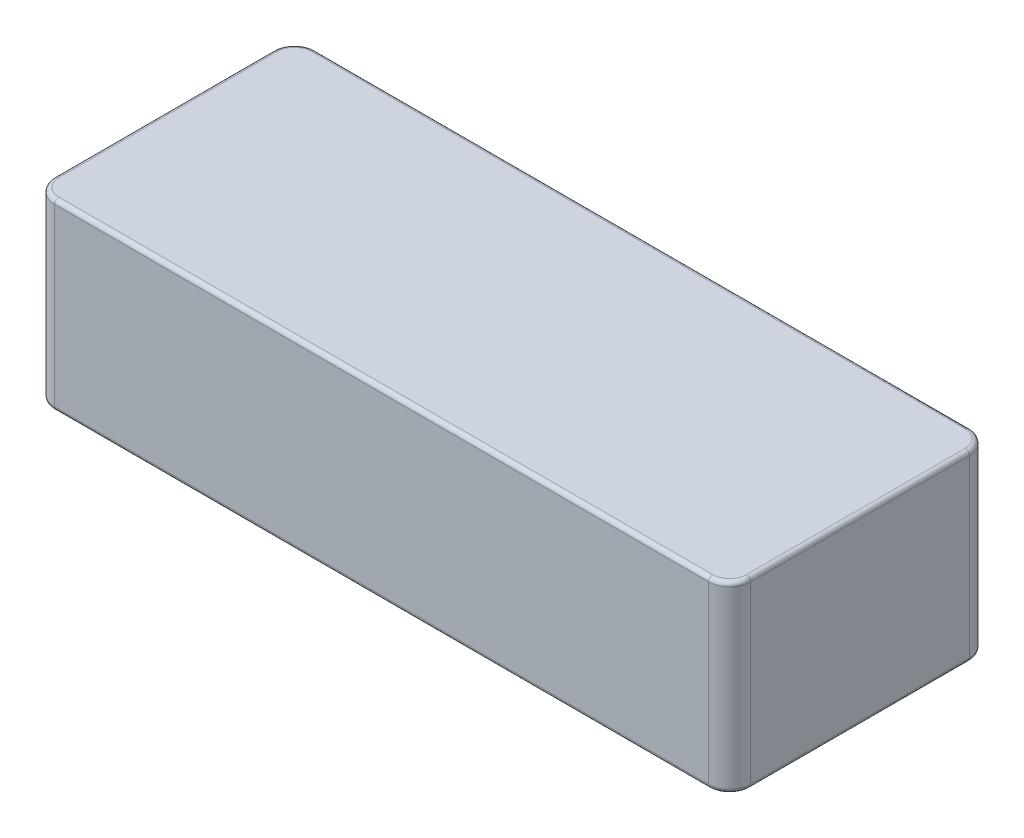
ISO-10303-21;
HEADER;
FILE_DESCRIPTION(('STEP AP214'),'2;1');
FILE_NAME('part.step','',(''),(''),'','','');
FILE_SCHEMA(('AUTOMOTIVE_DESIGN { 1 0 10303 214 1 1 1 1 }'));
ENDSEC;
DATA;
#1=APPLICATION_CONTEXT('core data for automotive mechanical design processes');
#2=APPLICATION_PROTOCOL_DEFINITION('international standard','automotive_design',2000,#1);
#3=PRODUCT_CONTEXT('',#1,'mechanical');
#4=PRODUCT('Part','Part','',(#3));
#5=PRODUCT_RELATED_PRODUCT_CATEGORY('part','',(#4));
#6=PRODUCT_DEFINITION_FORMATION('','',#4);
#7=PRODUCT_DEFINITION_CONTEXT('part definition',#1,'design');
#8=PRODUCT_DEFINITION('design','',#6,#7);
#9=PRODUCT_DEFINITION_SHAPE('','',#8);
#10=(LENGTH_UNIT() NAMED_UNIT(*) SI_UNIT(.MILLI.,.METRE.));
#11=(NAMED_UNIT(*) PLANE_ANGLE_UNIT() SI_UNIT($,.RADIAN.));
#12=(NAMED_UNIT(*) SI_UNIT($,.STERADIAN.) SOLID_ANGLE_UNIT());
#13=UNCERTAINTY_MEASURE_WITH_UNIT(LENGTH_MEASURE(1.E-05),#10,'distance_accuracy_value','');
#14=(GEOMETRIC_REPRESENTATION_CONTEXT(3) GLOBAL_UNCERTAINTY_ASSIGNED_CONTEXT((#13)) GLOBAL_UNIT_ASSIGNED_CONTEXT((#10,
#11,#12)) REPRESENTATION_CONTEXT('',''));
#15=CARTESIAN_POINT('',(0.,0.,0.));
#16=DIRECTION('',(0.,0.,1.));
#17=DIRECTION('',(1.,0.,0.));
#18=AXIS2_PLACEMENT_3D('',#15,#16,#17);
#19=CARTESIAN_POINT('',(83.,43.8,31.1));
#20=DIRECTION('',(-1.,0.,0.));
#21=DIRECTION('',(0.,0.,1.));
#22=AXIS2_PLACEMENT_3D('',#19,#20,#21);
#23=PLANE('',#22);
#24=DIRECTION('',(0.,-1.,0.));
#25=VECTOR('',#24,1.);
#26=CARTESIAN_POINT('',(83.,43.8,26.1));
#27=LINE('',#26,#25);
#28=CARTESIAN_POINT('',(83.,42.8,26.1));
#29=VERTEX_POINT('',#28);
#30=CARTESIAN_POINT('',(83.,1.,26.1));
#31=VERTEX_POINT('',#30);
#32=EDGE_CURVE('E290',#29,#31,#27,.T.);
#33=ORIENTED_EDGE('',*,*,#32,.T.);
#34=DIRECTION('',(0.,0.,-1.));
#35=VECTOR('',#34,1.);
#36=CARTESIAN_POINT('',(83.,1.,-26.1));
#37=LINE('',#36,#35);
#38=CARTESIAN_POINT('',(83.,1.,-26.1));
#39=VERTEX_POINT('',#38);
#40=EDGE_CURVE('E207',#31,#39,#37,.T.);
#41=ORIENTED_EDGE('',*,*,#40,.T.);
#42=DIRECTION('',(0.,-1.,0.));
#43=VECTOR('',#42,1.);
#44=CARTESIAN_POINT('',(83.,43.8,-26.1));
#45=LINE('',#44,#43);
#46=CARTESIAN_POINT('',(83.,42.8,-26.1));
#47=VERTEX_POINT('',#46);
#48=EDGE_CURVE('E295',#39,#47,#45,.F.);
#49=ORIENTED_EDGE('',*,*,#48,.T.);
#50=DIRECTION('',(0.,0.,-1.));
#51=VECTOR('',#50,1.);
#52=CARTESIAN_POINT('',(83.,42.8,31.1));
#53=LINE('',#52,#51);
#54=EDGE_CURVE('E205',#47,#29,#53,.F.);
#55=ORIENTED_EDGE('',*,*,#54,.T.);
#56=EDGE_LOOP('',(#33,#41,#49,#55));
#57=FACE_BOUND('',#56,.T.);
#58=ADVANCED_FACE('F41',(#57),#23,.F.);
#59=CARTESIAN_POINT('',(-83.,43.8,-31.1));
#60=DIRECTION('',(0.,0.,1.));
#61=DIRECTION('',(1.,0.,0.));
#62=AXIS2_PLACEMENT_3D('',#59,#60,#61);
#63=PLANE('',#62);
#64=DIRECTION('',(0.,-1.,0.));
#65=VECTOR('',#64,1.);
#66=CARTESIAN_POINT('',(78.,43.8,-31.1));
#67=LINE('',#66,#65);
#68=CARTESIAN_POINT('',(78.,42.8,-31.1));
#69=VERTEX_POINT('',#68);
#70=CARTESIAN_POINT('',(78.,1.,-31.1));
#71=VERTEX_POINT('',#70);
#72=EDGE_CURVE('E288',#69,#71,#67,.T.);
#73=ORIENTED_EDGE('',*,*,#72,.T.);
#74=DIRECTION('',(-1.,0.,0.));
#75=VECTOR('',#74,1.);
#76=CARTESIAN_POINT('',(-78.,1.,-31.1));
#77=LINE('',#76,#75);
#78=CARTESIAN_POINT('',(-78.,1.,-31.1));
#79=VERTEX_POINT('',#78);
#80=EDGE_CURVE('E215',#71,#79,#77,.T.);
#81=ORIENTED_EDGE('',*,*,#80,.T.);
#82=DIRECTION('',(0.,-1.,0.));
#83=VECTOR('',#82,1.);
#84=CARTESIAN_POINT('',(-78.,43.8,-31.1));
#85=LINE('',#84,#83);
#86=CARTESIAN_POINT('',(-78.,42.8,-31.1));
#87=VERTEX_POINT('',#86);
#88=EDGE_CURVE('E246',#79,#87,#85,.F.);
#89=ORIENTED_EDGE('',*,*,#88,.T.);
#90=DIRECTION('',(-1.,0.,0.));
#91=VECTOR('',#90,1.);
#92=CARTESIAN_POINT('',(-83.,42.8,-31.1));
#93=LINE('',#92,#91);
#94=EDGE_CURVE('E213',#87,#69,#93,.F.);
#95=ORIENTED_EDGE('',*,*,#94,.T.);
#96=EDGE_LOOP('',(#73,#81,#89,#95));
#97=FACE_BOUND('',#96,.T.);
#98=ADVANCED_FACE('F286',(#97),#63,.F.);
#99=CARTESIAN_POINT('',(-83.,43.8,31.1));
#100=DIRECTION('',(1.,0.,0.));
#101=DIRECTION('',(0.,0.,-1.));
#102=AXIS2_PLACEMENT_3D('',#99,#100,#101);
#103=PLANE('',#102);
#104=DIRECTION('',(0.,-1.,0.));
#105=VECTOR('',#104,1.);
#106=CARTESIAN_POINT('',(-83.,43.8,-26.1));
#107=LINE('',#106,#105);
#108=CARTESIAN_POINT('',(-83.,42.8,-26.1));
#109=VERTEX_POINT('',#108);
#110=CARTESIAN_POINT('',(-83.,1.,-26.1));
#111=VERTEX_POINT('',#110);
#112=EDGE_CURVE('E174',#109,#111,#107,.T.);
#113=ORIENTED_EDGE('',*,*,#112,.T.);
#114=DIRECTION('',(0.,0.,1.));
#115=VECTOR('',#114,1.);
#116=CARTESIAN_POINT('',(-83.,1.,26.1));
#117=LINE('',#116,#115);
#118=CARTESIAN_POINT('',(-83.,1.,26.1));
#119=VERTEX_POINT('',#118);
#120=EDGE_CURVE('E190',#111,#119,#117,.T.);
#121=ORIENTED_EDGE('',*,*,#120,.T.);
#122=DIRECTION('',(0.,-1.,0.));
#123=VECTOR('',#122,1.);
#124=CARTESIAN_POINT('',(-83.,43.8,26.1));
#125=LINE('',#124,#123);
#126=CARTESIAN_POINT('',(-83.,42.8,26.1));
#127=VERTEX_POINT('',#126);
#128=EDGE_CURVE('E304',#119,#127,#125,.F.);
#129=ORIENTED_EDGE('',*,*,#128,.T.);
#130=DIRECTION('',(0.,0.,1.));
#131=VECTOR('',#130,1.);
#132=CARTESIAN_POINT('',(-83.,42.8,31.1));
#133=LINE('',#132,#131);
#134=EDGE_CURVE('E188',#127,#109,#133,.F.);
#135=ORIENTED_EDGE('',*,*,#134,.T.);
#136=EDGE_LOOP('',(#113,#121,#129,#135));
#137=FACE_BOUND('',#136,.T.);
#138=ADVANCED_FACE('F326',(#137),#103,.F.);
#139=CARTESIAN_POINT('',(-83.,43.8,31.1));
#140=DIRECTION('',(0.,0.,-1.));
#141=DIRECTION('',(-1.,0.,0.));
#142=AXIS2_PLACEMENT_3D('',#139,#140,#141);
#143=PLANE('',#142);
#144=DIRECTION('',(0.,-1.,0.));
#145=VECTOR('',#144,1.);
#146=CARTESIAN_POINT('',(-78.,43.8,31.1));
#147=LINE('',#146,#145);
#148=CARTESIAN_POINT('',(-78.,42.8,31.1));
#149=VERTEX_POINT('',#148);
#150=CARTESIAN_POINT('',(-78.,1.,31.1));
#151=VERTEX_POINT('',#150);
#152=EDGE_CURVE('E298',#149,#151,#147,.T.);
#153=ORIENTED_EDGE('',*,*,#152,.T.);
#154=DIRECTION('',(1.,0.,0.));
#155=VECTOR('',#154,1.);
#156=CARTESIAN_POINT('',(78.,1.,31.1));
#157=LINE('',#156,#155);
#158=CARTESIAN_POINT('',(78.,1.,31.1));
#159=VERTEX_POINT('',#158);
#160=EDGE_CURVE('E198',#151,#159,#157,.T.);
#161=ORIENTED_EDGE('',*,*,#160,.T.);
#162=DIRECTION('',(0.,-1.,0.));
#163=VECTOR('',#162,1.);
#164=CARTESIAN_POINT('',(78.,43.8,31.1));
#165=LINE('',#164,#163);
#166=CARTESIAN_POINT('',(78.,42.8,31.1));
#167=VERTEX_POINT('',#166);
#168=EDGE_CURVE('E301',#159,#167,#165,.F.);
#169=ORIENTED_EDGE('',*,*,#168,.T.);
#170=DIRECTION('',(1.,0.,0.));
#171=VECTOR('',#170,1.);
#172=CARTESIAN_POINT('',(-83.,42.8,31.1));
#173=LINE('',#172,#171);
#174=EDGE_CURVE('E196',#167,#149,#173,.F.);
#175=ORIENTED_EDGE('',*,*,#174,.T.);
#176=EDGE_LOOP('',(#153,#161,#169,#175));
#177=FACE_BOUND('',#176,.T.);
#178=ADVANCED_FACE('F369',(#177),#143,.F.);
#179=CARTESIAN_POINT('',(0.,43.8,0.));
#180=DIRECTION('',(0.,-1.,0.));
#181=DIRECTION('',(0.,0.,-1.));
#182=AXIS2_PLACEMENT_3D('',#179,#180,#181);
#183=PLANE('',#182);
#184=DIRECTION('',(1.,0.,0.));
#185=VECTOR('',#184,1.);
#186=CARTESIAN_POINT('',(0.,43.8,30.1));
#187=LINE('',#186,#185);
#188=CARTESIAN_POINT('',(-78.,43.8,30.1));
#189=VERTEX_POINT('',#188);
#190=CARTESIAN_POINT('',(78.,43.8,30.1));
#191=VERTEX_POINT('',#190);
#192=EDGE_CURVE('E50',#189,#191,#187,.T.);
#193=ORIENTED_EDGE('',*,*,#192,.T.);
#194=CARTESIAN_POINT('',(78.,43.8,26.1));
#195=DIRECTION('',(0.,-1.,0.));
#196=DIRECTION('',(0.,0.,-1.));
#197=AXIS2_PLACEMENT_3D('',#194,#195,#196);
#198=CIRCLE('',#197,4.);
#199=CARTESIAN_POINT('',(82.,43.8,26.1));
#200=VERTEX_POINT('',#199);
#201=EDGE_CURVE('E11',#191,#200,#198,.F.);
#202=ORIENTED_EDGE('',*,*,#201,.T.);
#203=DIRECTION('',(0.,0.,-1.));
#204=VECTOR('',#203,1.);
#205=CARTESIAN_POINT('',(82.,43.8,0.));
#206=LINE('',#205,#204);
#207=CARTESIAN_POINT('',(82.,43.8,-26.1));
#208=VERTEX_POINT('',#207);
#209=EDGE_CURVE('E217',#200,#208,#206,.T.);
#210=ORIENTED_EDGE('',*,*,#209,.T.);
#211=CARTESIAN_POINT('',(78.,43.8,-26.1));
#212=DIRECTION('',(0.,-1.,0.));
#213=DIRECTION('',(0.,0.,-1.));
#214=AXIS2_PLACEMENT_3D('',#211,#212,#213);
#215=CIRCLE('',#214,4.);
#216=CARTESIAN_POINT('',(78.,43.8,-30.1));
#217=VERTEX_POINT('',#216);
#218=EDGE_CURVE('E219',#208,#217,#215,.F.);
#219=ORIENTED_EDGE('',*,*,#218,.T.);
#220=DIRECTION('',(-1.,0.,0.));
#221=VECTOR('',#220,1.);
#222=CARTESIAN_POINT('',(0.,43.8,-30.1));
#223=LINE('',#222,#221);
#224=CARTESIAN_POINT('',(-78.,43.8,-30.1));
#225=VERTEX_POINT('',#224);
#226=EDGE_CURVE('E221',#217,#225,#223,.T.);
#227=ORIENTED_EDGE('',*,*,#226,.T.);
#228=CARTESIAN_POINT('',(-78.,43.8,-26.1));
#229=DIRECTION('',(0.,-1.,0.));
#230=DIRECTION('',(0.,0.,-1.));
#231=AXIS2_PLACEMENT_3D('',#228,#229,#230);
#232=CIRCLE('',#231,4.);
#233=CARTESIAN_POINT('',(-82.,43.8,-26.1));
#234=VERTEX_POINT('',#233);
#235=EDGE_CURVE('E223',#225,#234,#232,.F.);
#236=ORIENTED_EDGE('',*,*,#235,.T.);
#237=DIRECTION('',(0.,0.,1.));
#238=VECTOR('',#237,1.);
#239=CARTESIAN_POINT('',(-82.,43.8,0.));
#240=LINE('',#239,#238);
#241=CARTESIAN_POINT('',(-82.,43.8,26.1));
#242=VERTEX_POINT('',#241);
#243=EDGE_CURVE('E225',#234,#242,#240,.T.);
#244=ORIENTED_EDGE('',*,*,#243,.T.);
#245=CARTESIAN_POINT('',(-78.,43.8,26.1));
#246=DIRECTION('',(0.,-1.,0.));
#247=DIRECTION('',(0.,0.,-1.));
#248=AXIS2_PLACEMENT_3D('',#245,#246,#247);
#249=CIRCLE('',#248,4.);
#250=EDGE_CURVE('E61',#242,#189,#249,.F.);
#251=ORIENTED_EDGE('',*,*,#250,.T.);
#252=EDGE_LOOP('',(#193,#202,#210,#219,#227,#236,#244,#251));
#253=FACE_BOUND('',#252,.T.);
#254=ADVANCED_FACE('F342',(#253),#183,.F.);
#255=CARTESIAN_POINT('',(0.,0.,0.));
#256=DIRECTION('',(0.,-1.,0.));
#257=DIRECTION('',(0.,0.,-1.));
#258=AXIS2_PLACEMENT_3D('',#255,#256,#257);
#259=PLANE('',#258);
#260=DIRECTION('',(0.,0.,1.));
#261=VECTOR('',#260,1.);
#262=CARTESIAN_POINT('',(-82.,0.,-26.1));
#263=LINE('',#262,#261);
#264=CARTESIAN_POINT('',(-82.,0.,26.1));
#265=VERTEX_POINT('',#264);
#266=CARTESIAN_POINT('',(-82.,0.,-26.1));
#267=VERTEX_POINT('',#266);
#268=EDGE_CURVE('E178',#265,#267,#263,.F.);
#269=ORIENTED_EDGE('',*,*,#268,.T.);
#270=CARTESIAN_POINT('',(-78.,0.,-26.1));
#271=DIRECTION('',(0.,-1.,0.));
#272=DIRECTION('',(0.,0.,-1.));
#273=AXIS2_PLACEMENT_3D('',#270,#271,#272);
#274=CIRCLE('',#273,4.);
#275=CARTESIAN_POINT('',(-78.,0.,-30.1));
#276=VERTEX_POINT('',#275);
#277=EDGE_CURVE('E159',#267,#276,#274,.T.);
#278=ORIENTED_EDGE('',*,*,#277,.T.);
#279=DIRECTION('',(-1.,0.,0.));
#280=VECTOR('',#279,1.);
#281=CARTESIAN_POINT('',(78.,0.,-30.1));
#282=LINE('',#281,#280);
#283=CARTESIAN_POINT('',(78.,0.,-30.1));
#284=VERTEX_POINT('',#283);
#285=EDGE_CURVE('E167',#276,#284,#282,.F.);
#286=ORIENTED_EDGE('',*,*,#285,.T.);
#287=CARTESIAN_POINT('',(78.,0.,-26.1));
#288=DIRECTION('',(0.,-1.,0.));
#289=DIRECTION('',(0.,0.,-1.));
#290=AXIS2_PLACEMENT_3D('',#287,#288,#289);
#291=CIRCLE('',#290,4.);
#292=CARTESIAN_POINT('',(82.,0.,-26.1));
#293=VERTEX_POINT('',#292);
#294=EDGE_CURVE('E173',#284,#293,#291,.T.);
#295=ORIENTED_EDGE('',*,*,#294,.T.);
#296=DIRECTION('',(0.,0.,-1.));
#297=VECTOR('',#296,1.);
#298=CARTESIAN_POINT('',(82.,0.,26.1));
#299=LINE('',#298,#297);
#300=CARTESIAN_POINT('',(82.,0.,26.1));
#301=VERTEX_POINT('',#300);
#302=EDGE_CURVE('E309',#293,#301,#299,.F.);
#303=ORIENTED_EDGE('',*,*,#302,.T.);
#304=CARTESIAN_POINT('',(78.,0.,26.1));
#305=DIRECTION('',(0.,-1.,0.));
#306=DIRECTION('',(0.,0.,-1.));
#307=AXIS2_PLACEMENT_3D('',#304,#305,#306);
#308=CIRCLE('',#307,4.);
#309=CARTESIAN_POINT('',(78.,0.,30.1));
#310=VERTEX_POINT('',#309);
#311=EDGE_CURVE('E311',#301,#310,#308,.T.);
#312=ORIENTED_EDGE('',*,*,#311,.T.);
#313=DIRECTION('',(1.,0.,0.));
#314=VECTOR('',#313,1.);
#315=CARTESIAN_POINT('',(-78.,0.,30.1));
#316=LINE('',#315,#314);
#317=CARTESIAN_POINT('',(-78.,0.,30.1));
#318=VERTEX_POINT('',#317);
#319=EDGE_CURVE('E313',#310,#318,#316,.F.);
#320=ORIENTED_EDGE('',*,*,#319,.T.);
#321=CARTESIAN_POINT('',(-78.,0.,26.1));
#322=DIRECTION('',(0.,-1.,0.));
#323=DIRECTION('',(0.,0.,-1.));
#324=AXIS2_PLACEMENT_3D('',#321,#322,#323);
#325=CIRCLE('',#324,4.);
#326=EDGE_CURVE('E183',#318,#265,#325,.T.);
#327=ORIENTED_EDGE('',*,*,#326,.T.);
#328=EDGE_LOOP('',(#269,#278,#286,#295,#303,#312,#320,#327));
#329=FACE_BOUND('',#328,.T.);
#330=ADVANCED_FACE('F176',(#329),#259,.T.);
#331=CARTESIAN_POINT('',(78.,43.8,-26.1));
#332=DIRECTION('',(0.,-1.,0.));
#333=DIRECTION('',(0.,0.,-1.));
#334=AXIS2_PLACEMENT_3D('',#331,#332,#333);
#335=CYLINDRICAL_SURFACE('',#334,5.);
#336=ORIENTED_EDGE('',*,*,#48,.F.);
#337=CARTESIAN_POINT('',(78.,1.,-26.1));
#338=DIRECTION('',(0.,-1.,0.));
#339=DIRECTION('',(0.,0.,-1.));
#340=AXIS2_PLACEMENT_3D('',#337,#338,#339);
#341=CIRCLE('',#340,5.);
#342=EDGE_CURVE('E211',#39,#71,#341,.F.);
#343=ORIENTED_EDGE('',*,*,#342,.T.);
#344=ORIENTED_EDGE('',*,*,#72,.F.);
#345=CARTESIAN_POINT('',(78.,42.8,-26.1));
#346=DIRECTION('',(0.,-1.,0.));
#347=DIRECTION('',(0.,0.,-1.));
#348=AXIS2_PLACEMENT_3D('',#345,#346,#347);
#349=CIRCLE('',#348,5.);
#350=EDGE_CURVE('E209',#69,#47,#349,.T.);
#351=ORIENTED_EDGE('',*,*,#350,.T.);
#352=EDGE_LOOP('',(#336,#343,#344,#351));
#353=FACE_BOUND('',#352,.T.);
#354=ADVANCED_FACE('F386',(#353),#335,.T.);
#355=CARTESIAN_POINT('',(78.,43.8,26.1));
#356=DIRECTION('',(0.,-1.,0.));
#357=DIRECTION('',(0.,0.,-1.));
#358=AXIS2_PLACEMENT_3D('',#355,#356,#357);
#359=CYLINDRICAL_SURFACE('',#358,5.);
#360=ORIENTED_EDGE('',*,*,#168,.F.);
#361=CARTESIAN_POINT('',(78.,1.,26.1));
#362=DIRECTION('',(0.,-1.,0.));
#363=DIRECTION('',(0.,0.,-1.));
#364=AXIS2_PLACEMENT_3D('',#361,#362,#363);
#365=CIRCLE('',#364,5.);
#366=EDGE_CURVE('E203',#159,#31,#365,.F.);
#367=ORIENTED_EDGE('',*,*,#366,.T.);
#368=ORIENTED_EDGE('',*,*,#32,.F.);
#369=CARTESIAN_POINT('',(78.,42.8,26.1));
#370=DIRECTION('',(0.,-1.,0.));
#371=DIRECTION('',(0.,0.,-1.));
#372=AXIS2_PLACEMENT_3D('',#369,#370,#371);
#373=CIRCLE('',#372,5.);
#374=EDGE_CURVE('E200',#29,#167,#373,.T.);
#375=ORIENTED_EDGE('',*,*,#374,.T.);
#376=EDGE_LOOP('',(#360,#367,#368,#375));
#377=FACE_BOUND('',#376,.T.);
#378=ADVANCED_FACE('F358',(#377),#359,.T.);
#379=CARTESIAN_POINT('',(-78.,43.8,-26.1));
#380=DIRECTION('',(0.,-1.,0.));
#381=DIRECTION('',(0.,0.,-1.));
#382=AXIS2_PLACEMENT_3D('',#379,#380,#381);
#383=CYLINDRICAL_SURFACE('',#382,5.);
#384=ORIENTED_EDGE('',*,*,#88,.F.);
#385=CARTESIAN_POINT('',(-78.,1.,-26.1));
#386=DIRECTION('',(0.,-1.,0.));
#387=DIRECTION('',(0.,0.,-1.));
#388=AXIS2_PLACEMENT_3D('',#385,#386,#387);
#389=CIRCLE('',#388,5.);
#390=EDGE_CURVE('E161',#79,#111,#389,.F.);
#391=ORIENTED_EDGE('',*,*,#390,.T.);
#392=ORIENTED_EDGE('',*,*,#112,.F.);
#393=CARTESIAN_POINT('',(-78.,42.8,-26.1));
#394=DIRECTION('',(0.,-1.,0.));
#395=DIRECTION('',(0.,0.,-1.));
#396=AXIS2_PLACEMENT_3D('',#393,#394,#395);
#397=CIRCLE('',#396,5.);
#398=EDGE_CURVE('E180',#109,#87,#397,.T.);
#399=ORIENTED_EDGE('',*,*,#398,.T.);
#400=EDGE_LOOP('',(#384,#391,#392,#399));
#401=FACE_BOUND('',#400,.T.);
#402=ADVANCED_FACE('F282',(#401),#383,.T.);
#403=CARTESIAN_POINT('',(-78.,43.8,26.1));
#404=DIRECTION('',(0.,-1.,0.));
#405=DIRECTION('',(0.,0.,-1.));
#406=AXIS2_PLACEMENT_3D('',#403,#404,#405);
#407=CYLINDRICAL_SURFACE('',#406,5.);
#408=ORIENTED_EDGE('',*,*,#128,.F.);
#409=CARTESIAN_POINT('',(-78.,1.,26.1));
#410=DIRECTION('',(0.,-1.,0.));
#411=DIRECTION('',(0.,0.,-1.));
#412=AXIS2_PLACEMENT_3D('',#409,#410,#411);
#413=CIRCLE('',#412,5.);
#414=EDGE_CURVE('E194',#119,#151,#413,.F.);
#415=ORIENTED_EDGE('',*,*,#414,.T.);
#416=ORIENTED_EDGE('',*,*,#152,.F.);
#417=CARTESIAN_POINT('',(-78.,42.8,26.1));
#418=DIRECTION('',(0.,-1.,0.));
#419=DIRECTION('',(0.,0.,-1.));
#420=AXIS2_PLACEMENT_3D('',#417,#418,#419);
#421=CIRCLE('',#420,5.);
#422=EDGE_CURVE('E192',#149,#127,#421,.T.);
#423=ORIENTED_EDGE('',*,*,#422,.T.);
#424=EDGE_LOOP('',(#408,#415,#416,#423));
#425=FACE_BOUND('',#424,.T.);
#426=ADVANCED_FACE('F328',(#425),#407,.T.);
#427=CARTESIAN_POINT('',(78.,1.,26.1));
#428=DIRECTION('',(0.,-1.,0.));
#429=DIRECTION('',(0.,0.,-1.));
#430=AXIS2_PLACEMENT_3D('',#427,#428,#429);
#431=TOROIDAL_SURFACE('',#430,4.,1.);
#432=CARTESIAN_POINT('',(82.,1.,26.1));
#433=DIRECTION('',(0.,0.,-1.));
#434=DIRECTION('',(-1.,0.,0.));
#435=AXIS2_PLACEMENT_3D('',#432,#433,#434);
#436=CIRCLE('',#435,1.);
#437=EDGE_CURVE('E240',#31,#301,#436,.T.);
#438=ORIENTED_EDGE('',*,*,#437,.F.);
#439=ORIENTED_EDGE('',*,*,#366,.F.);
#440=CARTESIAN_POINT('',(78.,1.,30.1));
#441=DIRECTION('',(-1.,0.,0.));
#442=DIRECTION('',(0.,0.,1.));
#443=AXIS2_PLACEMENT_3D('',#440,#441,#442);
#444=CIRCLE('',#443,1.);
#445=EDGE_CURVE('E243',#310,#159,#444,.T.);
#446=ORIENTED_EDGE('',*,*,#445,.F.);
#447=ORIENTED_EDGE('',*,*,#311,.F.);
#448=EDGE_LOOP('',(#438,#439,#446,#447));
#449=FACE_BOUND('',#448,.T.);
#450=ADVANCED_FACE('F362',(#449),#431,.T.);
#451=CARTESIAN_POINT('',(-83.,1.,30.1));
#452=DIRECTION('',(-1.,0.,0.));
#453=DIRECTION('',(0.,0.,1.));
#454=AXIS2_PLACEMENT_3D('',#451,#452,#453);
#455=CYLINDRICAL_SURFACE('',#454,1.);
#456=ORIENTED_EDGE('',*,*,#445,.T.);
#457=ORIENTED_EDGE('',*,*,#160,.F.);
#458=CARTESIAN_POINT('',(-78.,1.,30.1));
#459=DIRECTION('',(-1.,0.,0.));
#460=DIRECTION('',(0.,0.,1.));
#461=AXIS2_PLACEMENT_3D('',#458,#459,#460);
#462=CIRCLE('',#461,1.);
#463=EDGE_CURVE('E237',#318,#151,#462,.T.);
#464=ORIENTED_EDGE('',*,*,#463,.F.);
#465=ORIENTED_EDGE('',*,*,#319,.F.);
#466=EDGE_LOOP('',(#456,#457,#464,#465));
#467=FACE_BOUND('',#466,.T.);
#468=ADVANCED_FACE('F367',(#467),#455,.T.);
#469=CARTESIAN_POINT('',(82.,1.,31.1));
#470=DIRECTION('',(0.,0.,1.));
#471=DIRECTION('',(1.,0.,0.));
#472=AXIS2_PLACEMENT_3D('',#469,#470,#471);
#473=CYLINDRICAL_SURFACE('',#472,1.);
#474=ORIENTED_EDGE('',*,*,#437,.T.);
#475=ORIENTED_EDGE('',*,*,#302,.F.);
#476=CARTESIAN_POINT('',(82.,1.,-26.1));
#477=DIRECTION('',(0.,0.,-1.));
#478=DIRECTION('',(-1.,0.,0.));
#479=AXIS2_PLACEMENT_3D('',#476,#477,#478);
#480=CIRCLE('',#479,1.);
#481=EDGE_CURVE('E234',#39,#293,#480,.T.);
#482=ORIENTED_EDGE('',*,*,#481,.F.);
#483=ORIENTED_EDGE('',*,*,#40,.F.);
#484=EDGE_LOOP('',(#474,#475,#482,#483));
#485=FACE_BOUND('',#484,.T.);
#486=ADVANCED_FACE('F408',(#485),#473,.T.);
#487=CARTESIAN_POINT('',(-78.,1.,26.1));
#488=DIRECTION('',(0.,-1.,0.));
#489=DIRECTION('',(0.,0.,-1.));
#490=AXIS2_PLACEMENT_3D('',#487,#488,#489);
#491=TOROIDAL_SURFACE('',#490,4.,1.);
#492=ORIENTED_EDGE('',*,*,#463,.T.);
#493=ORIENTED_EDGE('',*,*,#414,.F.);
#494=CARTESIAN_POINT('',(-82.,1.,26.1));
#495=DIRECTION('',(0.,0.,-1.));
#496=DIRECTION('',(-1.,0.,0.));
#497=AXIS2_PLACEMENT_3D('',#494,#495,#496);
#498=CIRCLE('',#497,1.);
#499=EDGE_CURVE('E231',#265,#119,#498,.T.);
#500=ORIENTED_EDGE('',*,*,#499,.F.);
#501=ORIENTED_EDGE('',*,*,#326,.F.);
#502=EDGE_LOOP('',(#492,#493,#500,#501));
#503=FACE_BOUND('',#502,.T.);
#504=ADVANCED_FACE('F320',(#503),#491,.T.);
#505=CARTESIAN_POINT('',(78.,1.,-26.1));
#506=DIRECTION('',(0.,-1.,0.));
#507=DIRECTION('',(0.,0.,-1.));
#508=AXIS2_PLACEMENT_3D('',#505,#506,#507);
#509=TOROIDAL_SURFACE('',#508,4.,1.);
#510=ORIENTED_EDGE('',*,*,#481,.T.);
#511=ORIENTED_EDGE('',*,*,#294,.F.);
#512=CARTESIAN_POINT('',(78.,1.,-30.1));
#513=DIRECTION('',(-1.,0.,0.));
#514=DIRECTION('',(0.,0.,1.));
#515=AXIS2_PLACEMENT_3D('',#512,#513,#514);
#516=CIRCLE('',#515,1.);
#517=EDGE_CURVE('E170',#71,#284,#516,.T.);
#518=ORIENTED_EDGE('',*,*,#517,.F.);
#519=ORIENTED_EDGE('',*,*,#342,.F.);
#520=EDGE_LOOP('',(#510,#511,#518,#519));
#521=FACE_BOUND('',#520,.T.);
#522=ADVANCED_FACE('F402',(#521),#509,.T.);
#523=CARTESIAN_POINT('',(-82.,1.,31.1));
#524=DIRECTION('',(0.,0.,-1.));
#525=DIRECTION('',(-1.,0.,0.));
#526=AXIS2_PLACEMENT_3D('',#523,#524,#525);
#527=CYLINDRICAL_SURFACE('',#526,1.);
#528=ORIENTED_EDGE('',*,*,#499,.T.);
#529=ORIENTED_EDGE('',*,*,#120,.F.);
#530=CARTESIAN_POINT('',(-82.,1.,-26.1));
#531=DIRECTION('',(0.,0.,-1.));
#532=DIRECTION('',(-1.,0.,0.));
#533=AXIS2_PLACEMENT_3D('',#530,#531,#532);
#534=CIRCLE('',#533,1.);
#535=EDGE_CURVE('E164',#267,#111,#534,.T.);
#536=ORIENTED_EDGE('',*,*,#535,.F.);
#537=ORIENTED_EDGE('',*,*,#268,.F.);
#538=EDGE_LOOP('',(#528,#529,#536,#537));
#539=FACE_BOUND('',#538,.T.);
#540=ADVANCED_FACE('F323',(#539),#527,.T.);
#541=CARTESIAN_POINT('',(-83.,1.,-30.1));
#542=DIRECTION('',(1.,0.,0.));
#543=DIRECTION('',(0.,0.,-1.));
#544=AXIS2_PLACEMENT_3D('',#541,#542,#543);
#545=CYLINDRICAL_SURFACE('',#544,1.);
#546=ORIENTED_EDGE('',*,*,#517,.T.);
#547=ORIENTED_EDGE('',*,*,#285,.F.);
#548=CARTESIAN_POINT('',(-78.,1.,-30.1));
#549=DIRECTION('',(-1.,0.,0.));
#550=DIRECTION('',(0.,0.,1.));
#551=AXIS2_PLACEMENT_3D('',#548,#549,#550);
#552=CIRCLE('',#551,1.);
#553=EDGE_CURVE('E155',#79,#276,#552,.T.);
#554=ORIENTED_EDGE('',*,*,#553,.F.);
#555=ORIENTED_EDGE('',*,*,#80,.F.);
#556=EDGE_LOOP('',(#546,#547,#554,#555));
#557=FACE_BOUND('',#556,.T.);
#558=ADVANCED_FACE('F168',(#557),#545,.T.);
#559=CARTESIAN_POINT('',(-78.,1.,-26.1));
#560=DIRECTION('',(0.,-1.,0.));
#561=DIRECTION('',(0.,0.,-1.));
#562=AXIS2_PLACEMENT_3D('',#559,#560,#561);
#563=TOROIDAL_SURFACE('',#562,4.,1.);
#564=ORIENTED_EDGE('',*,*,#535,.T.);
#565=ORIENTED_EDGE('',*,*,#390,.F.);
#566=ORIENTED_EDGE('',*,*,#553,.T.);
#567=ORIENTED_EDGE('',*,*,#277,.F.);
#568=EDGE_LOOP('',(#564,#565,#566,#567));
#569=FACE_BOUND('',#568,.T.);
#570=ADVANCED_FACE('F157',(#569),#563,.T.);
#571=CARTESIAN_POINT('',(-78.,42.8,-26.1));
#572=DIRECTION('',(0.,-1.,0.));
#573=DIRECTION('',(0.,0.,-1.));
#574=AXIS2_PLACEMENT_3D('',#571,#572,#573);
#575=TOROIDAL_SURFACE('',#574,4.,1.);
#576=CARTESIAN_POINT('',(-78.,42.8,-30.1));
#577=DIRECTION('',(1.,0.,0.));
#578=DIRECTION('',(0.,0.,-1.));
#579=AXIS2_PLACEMENT_3D('',#576,#577,#578);
#580=CIRCLE('',#579,1.);
#581=EDGE_CURVE('E262',#87,#225,#580,.T.);
#582=ORIENTED_EDGE('',*,*,#581,.F.);
#583=ORIENTED_EDGE('',*,*,#398,.F.);
#584=CARTESIAN_POINT('',(-82.,42.8,-26.1));
#585=DIRECTION('',(0.,0.,1.));
#586=DIRECTION('',(1.,0.,0.));
#587=AXIS2_PLACEMENT_3D('',#584,#585,#586);
#588=CIRCLE('',#587,1.);
#589=EDGE_CURVE('E45',#234,#109,#588,.T.);
#590=ORIENTED_EDGE('',*,*,#589,.F.);
#591=ORIENTED_EDGE('',*,*,#235,.F.);
#592=EDGE_LOOP('',(#582,#583,#590,#591));
#593=FACE_BOUND('',#592,.T.);
#594=ADVANCED_FACE('F43',(#593),#575,.T.);
#595=CARTESIAN_POINT('',(-82.,42.8,0.));
#596=DIRECTION('',(0.,0.,1.));
#597=DIRECTION('',(1.,0.,0.));
#598=AXIS2_PLACEMENT_3D('',#595,#596,#597);
#599=CYLINDRICAL_SURFACE('',#598,1.);
#600=ORIENTED_EDGE('',*,*,#589,.T.);
#601=ORIENTED_EDGE('',*,*,#134,.F.);
#602=CARTESIAN_POINT('',(-82.,42.8,26.1));
#603=DIRECTION('',(0.,0.,1.));
#604=DIRECTION('',(1.,0.,0.));
#605=AXIS2_PLACEMENT_3D('',#602,#603,#604);
#606=CIRCLE('',#605,1.);
#607=EDGE_CURVE('E260',#242,#127,#606,.T.);
#608=ORIENTED_EDGE('',*,*,#607,.F.);
#609=ORIENTED_EDGE('',*,*,#243,.F.);
#610=EDGE_LOOP('',(#600,#601,#608,#609));
#611=FACE_BOUND('',#610,.T.);
#612=ADVANCED_FACE('F273',(#611),#599,.T.);
#613=CARTESIAN_POINT('',(0.,42.8,-30.1));
#614=DIRECTION('',(-1.,0.,0.));
#615=DIRECTION('',(0.,0.,1.));
#616=AXIS2_PLACEMENT_3D('',#613,#614,#615);
#617=CYLINDRICAL_SURFACE('',#616,1.);
#618=ORIENTED_EDGE('',*,*,#581,.T.);
#619=ORIENTED_EDGE('',*,*,#226,.F.);
#620=CARTESIAN_POINT('',(78.,42.8,-30.1));
#621=DIRECTION('',(1.,0.,0.));
#622=DIRECTION('',(0.,0.,-1.));
#623=AXIS2_PLACEMENT_3D('',#620,#621,#622);
#624=CIRCLE('',#623,1.);
#625=EDGE_CURVE('E257',#69,#217,#624,.T.);
#626=ORIENTED_EDGE('',*,*,#625,.F.);
#627=ORIENTED_EDGE('',*,*,#94,.F.);
#628=EDGE_LOOP('',(#618,#619,#626,#627));
#629=FACE_BOUND('',#628,.T.);
#630=ADVANCED_FACE('F426',(#629),#617,.T.);
#631=CARTESIAN_POINT('',(-78.,42.8,26.1));
#632=DIRECTION('',(0.,-1.,0.));
#633=DIRECTION('',(0.,0.,-1.));
#634=AXIS2_PLACEMENT_3D('',#631,#632,#633);
#635=TOROIDAL_SURFACE('',#634,4.,1.);
#636=ORIENTED_EDGE('',*,*,#607,.T.);
#637=ORIENTED_EDGE('',*,*,#422,.F.);
#638=CARTESIAN_POINT('',(-78.,42.8,30.1));
#639=DIRECTION('',(1.,0.,0.));
#640=DIRECTION('',(0.,0.,-1.));
#641=AXIS2_PLACEMENT_3D('',#638,#639,#640);
#642=CIRCLE('',#641,1.);
#643=EDGE_CURVE('E254',#189,#149,#642,.T.);
#644=ORIENTED_EDGE('',*,*,#643,.F.);
#645=ORIENTED_EDGE('',*,*,#250,.F.);
#646=EDGE_LOOP('',(#636,#637,#644,#645));
#647=FACE_BOUND('',#646,.T.);
#648=ADVANCED_FACE('F332',(#647),#635,.T.);
#649=CARTESIAN_POINT('',(78.,42.8,-26.1));
#650=DIRECTION('',(0.,-1.,0.));
#651=DIRECTION('',(0.,0.,-1.));
#652=AXIS2_PLACEMENT_3D('',#649,#650,#651);
#653=TOROIDAL_SURFACE('',#652,4.,1.);
#654=ORIENTED_EDGE('',*,*,#625,.T.);
#655=ORIENTED_EDGE('',*,*,#218,.F.);
#656=CARTESIAN_POINT('',(82.,42.8,-26.1));
#657=DIRECTION('',(0.,0.,1.));
#658=DIRECTION('',(1.,0.,0.));
#659=AXIS2_PLACEMENT_3D('',#656,#657,#658);
#660=CIRCLE('',#659,1.);
#661=EDGE_CURVE('E251',#47,#208,#660,.T.);
#662=ORIENTED_EDGE('',*,*,#661,.F.);
#663=ORIENTED_EDGE('',*,*,#350,.F.);
#664=EDGE_LOOP('',(#654,#655,#662,#663));
#665=FACE_BOUND('',#664,.T.);
#666=ADVANCED_FACE('F347',(#665),#653,.T.);
#667=CARTESIAN_POINT('',(0.,42.8,30.1));
#668=DIRECTION('',(1.,0.,0.));
#669=DIRECTION('',(0.,0.,-1.));
#670=AXIS2_PLACEMENT_3D('',#667,#668,#669);
#671=CYLINDRICAL_SURFACE('',#670,1.);
#672=ORIENTED_EDGE('',*,*,#643,.T.);
#673=ORIENTED_EDGE('',*,*,#174,.F.);
#674=CARTESIAN_POINT('',(78.,42.8,30.1));
#675=DIRECTION('',(1.,0.,0.));
#676=DIRECTION('',(0.,0.,-1.));
#677=AXIS2_PLACEMENT_3D('',#674,#675,#676);
#678=CIRCLE('',#677,1.);
#679=EDGE_CURVE('E249',#191,#167,#678,.T.);
#680=ORIENTED_EDGE('',*,*,#679,.F.);
#681=ORIENTED_EDGE('',*,*,#192,.F.);
#682=EDGE_LOOP('',(#672,#673,#680,#681));
#683=FACE_BOUND('',#682,.T.);
#684=ADVANCED_FACE('F335',(#683),#671,.T.);
#685=CARTESIAN_POINT('',(82.,42.8,0.));
#686=DIRECTION('',(0.,0.,-1.));
#687=DIRECTION('',(-1.,0.,0.));
#688=AXIS2_PLACEMENT_3D('',#685,#686,#687);
#689=CYLINDRICAL_SURFACE('',#688,1.);
#690=ORIENTED_EDGE('',*,*,#661,.T.);
#691=ORIENTED_EDGE('',*,*,#209,.F.);
#692=CARTESIAN_POINT('',(82.,42.8,26.1));
#693=DIRECTION('',(0.,0.,1.));
#694=DIRECTION('',(1.,0.,0.));
#695=AXIS2_PLACEMENT_3D('',#692,#693,#694);
#696=CIRCLE('',#695,1.);
#697=EDGE_CURVE('E247',#29,#200,#696,.T.);
#698=ORIENTED_EDGE('',*,*,#697,.F.);
#699=ORIENTED_EDGE('',*,*,#54,.F.);
#700=EDGE_LOOP('',(#690,#691,#698,#699));
#701=FACE_BOUND('',#700,.T.);
#702=ADVANCED_FACE('F351',(#701),#689,.T.);
#703=CARTESIAN_POINT('',(78.,42.8,26.1));
#704=DIRECTION('',(0.,-1.,0.));
#705=DIRECTION('',(0.,0.,-1.));
#706=AXIS2_PLACEMENT_3D('',#703,#704,#705);
#707=TOROIDAL_SURFACE('',#706,4.,1.);
#708=ORIENTED_EDGE('',*,*,#679,.T.);
#709=ORIENTED_EDGE('',*,*,#374,.F.);
#710=ORIENTED_EDGE('',*,*,#697,.T.);
#711=ORIENTED_EDGE('',*,*,#201,.F.);
#712=EDGE_LOOP('',(#708,#709,#710,#711));
#713=FACE_BOUND('',#712,.T.);
#714=ADVANCED_FACE('F339',(#713),#707,.T.);
#715=CLOSED_SHELL('',(#58,#98,#138,#178,#254,#330,#354,#378,#402,#426,#450,#468,#486,#504,#522,
#540,#558,#570,#594,#612,#630,#648,#666,#684,#702,#714));
#716=MANIFOLD_SOLID_BREP('B2',#715);
#717=ADVANCED_BREP_SHAPE_REPRESENTATION('',(#18,#716),#14);
#718=SHAPE_DEFINITION_REPRESENTATION(#9,#717);
ENDSEC;
END-ISO-10303-21;
